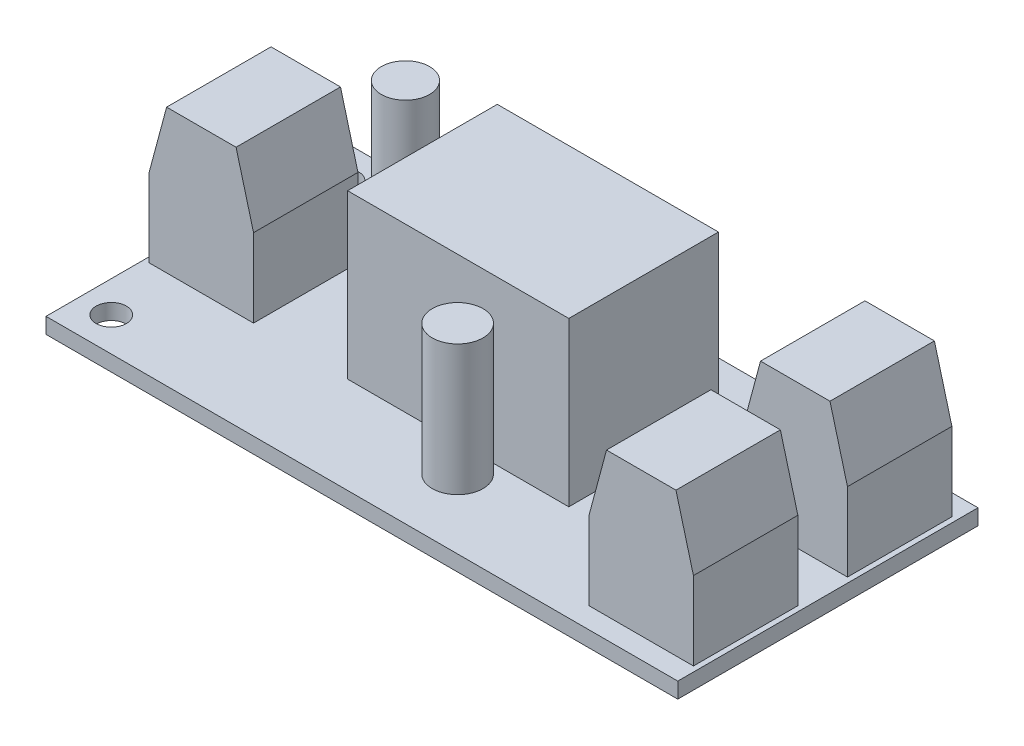
ISO-10303-21;
HEADER;
FILE_DESCRIPTION(('STEP AP214'),'2;1');
FILE_NAME('part.step','',(''),(''),'','','');
FILE_SCHEMA(('AUTOMOTIVE_DESIGN { 1 0 10303 214 1 1 1 1 }'));
ENDSEC;
DATA;
#1=APPLICATION_CONTEXT('core data for automotive mechanical design processes');
#2=APPLICATION_PROTOCOL_DEFINITION('international standard','automotive_design',2000,#1);
#3=PRODUCT_CONTEXT('',#1,'mechanical');
#4=PRODUCT('Part','Part','',(#3));
#5=PRODUCT_RELATED_PRODUCT_CATEGORY('part','',(#4));
#6=PRODUCT_DEFINITION_FORMATION('','',#4);
#7=PRODUCT_DEFINITION_CONTEXT('part definition',#1,'design');
#8=PRODUCT_DEFINITION('design','',#6,#7);
#9=PRODUCT_DEFINITION_SHAPE('','',#8);
#10=(LENGTH_UNIT() NAMED_UNIT(*) SI_UNIT(.MILLI.,.METRE.));
#11=(NAMED_UNIT(*) PLANE_ANGLE_UNIT() SI_UNIT($,.RADIAN.));
#12=(NAMED_UNIT(*) SI_UNIT($,.STERADIAN.) SOLID_ANGLE_UNIT());
#13=UNCERTAINTY_MEASURE_WITH_UNIT(LENGTH_MEASURE(1.E-05),#10,'distance_accuracy_value','');
#14=(GEOMETRIC_REPRESENTATION_CONTEXT(3) GLOBAL_UNCERTAINTY_ASSIGNED_CONTEXT((#13)) GLOBAL_UNIT_ASSIGNED_CONTEXT((#10,
#11,#12)) REPRESENTATION_CONTEXT('',''));
#15=CARTESIAN_POINT('',(0.,0.,0.));
#16=DIRECTION('',(0.,0.,1.));
#17=DIRECTION('',(1.,0.,0.));
#18=AXIS2_PLACEMENT_3D('',#15,#16,#17);
#19=CARTESIAN_POINT('',(0.,0.762,0.));
#20=DIRECTION('',(0.,1.,0.));
#21=DIRECTION('',(0.,0.,1.));
#22=AXIS2_PLACEMENT_3D('',#19,#20,#21);
#23=PLANE('',#22);
#24=CARTESIAN_POINT('',(2.57457069694945,0.762,7.86478445780455));
#25=DIRECTION('',(0.,1.,0.));
#26=DIRECTION('',(0.,0.,1.));
#27=AXIS2_PLACEMENT_3D('',#24,#25,#26);
#28=CIRCLE('',#27,2.46876642173235);
#29=CARTESIAN_POINT('',(2.57457069694945,0.762,10.3335508795369));
#30=VERTEX_POINT('',#29);
#31=EDGE_CURVE('E732',#30,#30,#28,.T.);
#32=ORIENTED_EDGE('',*,*,#31,.F.);
#33=EDGE_LOOP('',(#32));
#34=FACE_BOUND('',#33,.T.);
#35=CARTESIAN_POINT('',(-20.4202251169005,0.762,-10.0514061456245));
#36=DIRECTION('',(0.,1.,0.));
#37=DIRECTION('',(0.,0.,1.));
#38=AXIS2_PLACEMENT_3D('',#35,#36,#37);
#39=CIRCLE('',#38,2.3495);
#40=CARTESIAN_POINT('',(-20.4202251169005,0.762,-7.70190614562454));
#41=VERTEX_POINT('',#40);
#42=EDGE_CURVE('E232',#41,#41,#39,.T.);
#43=ORIENTED_EDGE('',*,*,#42,.F.);
#44=EDGE_LOOP('',(#43));
#45=FACE_BOUND('',#44,.T.);
#46=CARTESIAN_POINT('',(-27.686,0.762000000000001,-11.303));
#47=DIRECTION('',(0.,1.,0.));
#48=DIRECTION('',(0.,0.,1.));
#49=AXIS2_PLACEMENT_3D('',#46,#47,#48);
#50=CIRCLE('',#49,1.47319999999999);
#51=CARTESIAN_POINT('',(-27.686,0.762000000000001,-9.82980000000001));
#52=VERTEX_POINT('',#51);
#53=EDGE_CURVE('E320',#52,#52,#50,.T.);
#54=ORIENTED_EDGE('',*,*,#53,.F.);
#55=EDGE_LOOP('',(#54));
#56=FACE_BOUND('',#55,.T.);
#57=CARTESIAN_POINT('',(-27.686,0.762000000000001,11.303));
#58=DIRECTION('',(0.,1.,0.));
#59=DIRECTION('',(0.,0.,1.));
#60=AXIS2_PLACEMENT_3D('',#57,#58,#59);
#61=CIRCLE('',#60,1.47319999999999);
#62=CARTESIAN_POINT('',(-27.686,0.762000000000001,12.7762));
#63=VERTEX_POINT('',#62);
#64=EDGE_CURVE('E326',#63,#63,#61,.T.);
#65=ORIENTED_EDGE('',*,*,#64,.F.);
#66=EDGE_LOOP('',(#65));
#67=FACE_BOUND('',#66,.T.);
#68=DIRECTION('',(0.,0.,1.));
#69=VECTOR('',#68,1.);
#70=CARTESIAN_POINT('',(-30.734,0.762,-14.605));
#71=LINE('',#70,#69);
#72=CARTESIAN_POINT('',(-30.734,0.762,-14.605));
#73=VERTEX_POINT('',#72);
#74=CARTESIAN_POINT('',(-30.734,0.762,14.605));
#75=VERTEX_POINT('',#74);
#76=EDGE_CURVE('E333',#73,#75,#71,.T.);
#77=ORIENTED_EDGE('',*,*,#76,.T.);
#78=DIRECTION('',(1.,0.,0.));
#79=VECTOR('',#78,1.);
#80=CARTESIAN_POINT('',(-30.734,0.762,14.605));
#81=LINE('',#80,#79);
#82=CARTESIAN_POINT('',(30.734,0.762,14.605));
#83=VERTEX_POINT('',#82);
#84=EDGE_CURVE('E336',#75,#83,#81,.T.);
#85=ORIENTED_EDGE('',*,*,#84,.T.);
#86=DIRECTION('',(0.,0.,-1.));
#87=VECTOR('',#86,1.);
#88=CARTESIAN_POINT('',(30.734,0.762,-14.605));
#89=LINE('',#88,#87);
#90=CARTESIAN_POINT('',(30.734,0.762,-14.605));
#91=VERTEX_POINT('',#90);
#92=EDGE_CURVE('E339',#83,#91,#89,.T.);
#93=ORIENTED_EDGE('',*,*,#92,.T.);
#94=DIRECTION('',(-1.,0.,0.));
#95=VECTOR('',#94,1.);
#96=CARTESIAN_POINT('',(-30.734,0.762,-14.605));
#97=LINE('',#96,#95);
#98=EDGE_CURVE('E341',#91,#73,#97,.T.);
#99=ORIENTED_EDGE('',*,*,#98,.T.);
#100=EDGE_LOOP('',(#77,#85,#93,#99));
#101=FACE_BOUND('',#100,.T.);
#102=DIRECTION('',(1.,0.,0.));
#103=VECTOR('',#102,1.);
#104=CARTESIAN_POINT('',(-30.226,0.762,5.08));
#105=LINE('',#104,#103);
#106=CARTESIAN_POINT('',(-30.226,0.762,5.08));
#107=VERTEX_POINT('',#106);
#108=CARTESIAN_POINT('',(-20.066,0.762,5.08));
#109=VERTEX_POINT('',#108);
#110=EDGE_CURVE('E305',#107,#109,#105,.T.);
#111=ORIENTED_EDGE('',*,*,#110,.F.);
#112=DIRECTION('',(0.,0.,1.));
#113=VECTOR('',#112,1.);
#114=CARTESIAN_POINT('',(-30.226,0.762,-5.08));
#115=LINE('',#114,#113);
#116=CARTESIAN_POINT('',(-30.226,0.762,-5.08));
#117=VERTEX_POINT('',#116);
#118=EDGE_CURVE('E294',#117,#107,#115,.T.);
#119=ORIENTED_EDGE('',*,*,#118,.F.);
#120=DIRECTION('',(-1.,0.,0.));
#121=VECTOR('',#120,1.);
#122=CARTESIAN_POINT('',(-30.226,0.762,-5.08));
#123=LINE('',#122,#121);
#124=CARTESIAN_POINT('',(-20.066,0.762,-5.08));
#125=VERTEX_POINT('',#124);
#126=EDGE_CURVE('E299',#125,#117,#123,.T.);
#127=ORIENTED_EDGE('',*,*,#126,.F.);
#128=DIRECTION('',(0.,0.,-1.));
#129=VECTOR('',#128,1.);
#130=CARTESIAN_POINT('',(-20.066,0.762,-5.08));
#131=LINE('',#130,#129);
#132=EDGE_CURVE('E308',#109,#125,#131,.T.);
#133=ORIENTED_EDGE('',*,*,#132,.F.);
#134=EDGE_LOOP('',(#111,#119,#127,#133));
#135=FACE_BOUND('',#134,.T.);
#136=DIRECTION('',(1.,0.,0.));
#137=VECTOR('',#136,1.);
#138=CARTESIAN_POINT('',(20.066,0.762,-2.413));
#139=LINE('',#138,#137);
#140=CARTESIAN_POINT('',(20.066,0.762,-2.413));
#141=VERTEX_POINT('',#140);
#142=CARTESIAN_POINT('',(30.226,0.762,-2.413));
#143=VERTEX_POINT('',#142);
#144=EDGE_CURVE('E279',#141,#143,#139,.T.);
#145=ORIENTED_EDGE('',*,*,#144,.F.);
#146=DIRECTION('',(0.,0.,1.));
#147=VECTOR('',#146,1.);
#148=CARTESIAN_POINT('',(20.066,0.762,-12.573));
#149=LINE('',#148,#147);
#150=CARTESIAN_POINT('',(20.066,0.762,-12.573));
#151=VERTEX_POINT('',#150);
#152=EDGE_CURVE('E268',#151,#141,#149,.T.);
#153=ORIENTED_EDGE('',*,*,#152,.F.);
#154=DIRECTION('',(-1.,0.,0.));
#155=VECTOR('',#154,1.);
#156=CARTESIAN_POINT('',(20.066,0.762,-12.573));
#157=LINE('',#156,#155);
#158=CARTESIAN_POINT('',(30.226,0.762,-12.573));
#159=VERTEX_POINT('',#158);
#160=EDGE_CURVE('E273',#159,#151,#157,.T.);
#161=ORIENTED_EDGE('',*,*,#160,.F.);
#162=DIRECTION('',(0.,0.,-1.));
#163=VECTOR('',#162,1.);
#164=CARTESIAN_POINT('',(30.226,0.762,-12.573));
#165=LINE('',#164,#163);
#166=EDGE_CURVE('E282',#143,#159,#165,.T.);
#167=ORIENTED_EDGE('',*,*,#166,.F.);
#168=EDGE_LOOP('',(#145,#153,#161,#167));
#169=FACE_BOUND('',#168,.T.);
#170=DIRECTION('',(1.,0.,0.));
#171=VECTOR('',#170,1.);
#172=CARTESIAN_POINT('',(20.066,0.762,12.573));
#173=LINE('',#172,#171);
#174=CARTESIAN_POINT('',(20.066,0.762,12.573));
#175=VERTEX_POINT('',#174);
#176=CARTESIAN_POINT('',(30.226,0.762,12.573));
#177=VERTEX_POINT('',#176);
#178=EDGE_CURVE('E253',#175,#177,#173,.T.);
#179=ORIENTED_EDGE('',*,*,#178,.F.);
#180=DIRECTION('',(0.,0.,1.));
#181=VECTOR('',#180,1.);
#182=CARTESIAN_POINT('',(20.066,0.762,2.413));
#183=LINE('',#182,#181);
#184=CARTESIAN_POINT('',(20.066,0.762,2.413));
#185=VERTEX_POINT('',#184);
#186=EDGE_CURVE('E241',#185,#175,#183,.T.);
#187=ORIENTED_EDGE('',*,*,#186,.F.);
#188=DIRECTION('',(-1.,0.,0.));
#189=VECTOR('',#188,1.);
#190=CARTESIAN_POINT('',(20.066,0.762,2.413));
#191=LINE('',#190,#189);
#192=CARTESIAN_POINT('',(30.226,0.762,2.413));
#193=VERTEX_POINT('',#192);
#194=EDGE_CURVE('E247',#193,#185,#191,.T.);
#195=ORIENTED_EDGE('',*,*,#194,.F.);
#196=DIRECTION('',(0.,0.,-1.));
#197=VECTOR('',#196,1.);
#198=CARTESIAN_POINT('',(30.226,0.762,2.413));
#199=LINE('',#198,#197);
#200=EDGE_CURVE('E256',#177,#193,#199,.T.);
#201=ORIENTED_EDGE('',*,*,#200,.F.);
#202=EDGE_LOOP('',(#179,#187,#195,#201));
#203=FACE_BOUND('',#202,.T.);
#204=DIRECTION('',(1.,0.,0.));
#205=VECTOR('',#204,1.);
#206=CARTESIAN_POINT('',(-10.7687015204722,0.762,5.22328152139436));
#207=LINE('',#206,#205);
#208=CARTESIAN_POINT('',(-10.7687015204722,0.762,5.22328152139436));
#209=VERTEX_POINT('',#208);
#210=CARTESIAN_POINT('',(10.749255944685,0.762,5.22328152139436));
#211=VERTEX_POINT('',#210);
#212=EDGE_CURVE('E734',#209,#211,#207,.T.);
#213=ORIENTED_EDGE('',*,*,#212,.F.);
#214=DIRECTION('',(0.,0.,1.));
#215=VECTOR('',#214,1.);
#216=CARTESIAN_POINT('',(-10.7687015204722,0.762,-9.33777657794747));
#217=LINE('',#216,#215);
#218=CARTESIAN_POINT('',(-10.7687015204722,0.762,-9.33777657794747));
#219=VERTEX_POINT('',#218);
#220=EDGE_CURVE('E230',#219,#209,#217,.T.);
#221=ORIENTED_EDGE('',*,*,#220,.F.);
#222=DIRECTION('',(-1.,0.,0.));
#223=VECTOR('',#222,1.);
#224=CARTESIAN_POINT('',(-10.7687015204722,0.762,-9.33777657794747));
#225=LINE('',#224,#223);
#226=CARTESIAN_POINT('',(10.749255944685,0.762,-9.33777657794747));
#227=VERTEX_POINT('',#226);
#228=EDGE_CURVE('E226',#227,#219,#225,.T.);
#229=ORIENTED_EDGE('',*,*,#228,.F.);
#230=DIRECTION('',(0.,0.,-1.));
#231=VECTOR('',#230,1.);
#232=CARTESIAN_POINT('',(10.749255944685,0.762,-9.33777657794747));
#233=LINE('',#232,#231);
#234=EDGE_CURVE('E743',#211,#227,#233,.T.);
#235=ORIENTED_EDGE('',*,*,#234,.F.);
#236=EDGE_LOOP('',(#213,#221,#229,#235));
#237=FACE_BOUND('',#236,.T.);
#238=ADVANCED_FACE('F34',(#34,#45,#56,#67,#101,#135,#169,#203,#237),#23,.T.);
#239=CARTESIAN_POINT('',(-30.734,0.762,-14.605));
#240=DIRECTION('',(1.,0.,0.));
#241=DIRECTION('',(0.,0.,-1.));
#242=AXIS2_PLACEMENT_3D('',#239,#240,#241);
#243=PLANE('',#242);
#244=DIRECTION('',(0.,0.,1.));
#245=VECTOR('',#244,1.);
#246=CARTESIAN_POINT('',(-30.734,-0.762,-14.605));
#247=LINE('',#246,#245);
#248=CARTESIAN_POINT('',(-30.734,-0.762,-14.605));
#249=VERTEX_POINT('',#248);
#250=CARTESIAN_POINT('',(-30.734,-0.762,14.605));
#251=VERTEX_POINT('',#250);
#252=EDGE_CURVE('E332',#249,#251,#247,.T.);
#253=ORIENTED_EDGE('',*,*,#252,.T.);
#254=DIRECTION('',(0.,-1.,0.));
#255=VECTOR('',#254,1.);
#256=CARTESIAN_POINT('',(-30.734,0.762,14.605));
#257=LINE('',#256,#255);
#258=EDGE_CURVE('E359',#75,#251,#257,.T.);
#259=ORIENTED_EDGE('',*,*,#258,.F.);
#260=ORIENTED_EDGE('',*,*,#76,.F.);
#261=DIRECTION('',(0.,-1.,0.));
#262=VECTOR('',#261,1.);
#263=CARTESIAN_POINT('',(-30.734,0.762,-14.605));
#264=LINE('',#263,#262);
#265=EDGE_CURVE('E343',#73,#249,#264,.T.);
#266=ORIENTED_EDGE('',*,*,#265,.T.);
#267=EDGE_LOOP('',(#253,#259,#260,#266));
#268=FACE_BOUND('',#267,.T.);
#269=ADVANCED_FACE('F450',(#268),#243,.F.);
#270=CARTESIAN_POINT('',(-30.734,0.762,14.605));
#271=DIRECTION('',(0.,0.,-1.));
#272=DIRECTION('',(-1.,0.,0.));
#273=AXIS2_PLACEMENT_3D('',#270,#271,#272);
#274=PLANE('',#273);
#275=DIRECTION('',(1.,0.,0.));
#276=VECTOR('',#275,1.);
#277=CARTESIAN_POINT('',(-30.734,-0.762,14.605));
#278=LINE('',#277,#276);
#279=CARTESIAN_POINT('',(30.734,-0.762,14.605));
#280=VERTEX_POINT('',#279);
#281=EDGE_CURVE('E346',#251,#280,#278,.T.);
#282=ORIENTED_EDGE('',*,*,#281,.T.);
#283=DIRECTION('',(0.,-1.,0.));
#284=VECTOR('',#283,1.);
#285=CARTESIAN_POINT('',(30.734,0.762,14.605));
#286=LINE('',#285,#284);
#287=EDGE_CURVE('E356',#83,#280,#286,.T.);
#288=ORIENTED_EDGE('',*,*,#287,.F.);
#289=ORIENTED_EDGE('',*,*,#84,.F.);
#290=ORIENTED_EDGE('',*,*,#258,.T.);
#291=EDGE_LOOP('',(#282,#288,#289,#290));
#292=FACE_BOUND('',#291,.T.);
#293=ADVANCED_FACE('F456',(#292),#274,.F.);
#294=CARTESIAN_POINT('',(30.734,0.762,-14.605));
#295=DIRECTION('',(-1.,0.,0.));
#296=DIRECTION('',(0.,0.,1.));
#297=AXIS2_PLACEMENT_3D('',#294,#295,#296);
#298=PLANE('',#297);
#299=DIRECTION('',(0.,0.,-1.));
#300=VECTOR('',#299,1.);
#301=CARTESIAN_POINT('',(30.734,-0.762,-14.605));
#302=LINE('',#301,#300);
#303=CARTESIAN_POINT('',(30.734,-0.762,-14.605));
#304=VERTEX_POINT('',#303);
#305=EDGE_CURVE('E348',#280,#304,#302,.T.);
#306=ORIENTED_EDGE('',*,*,#305,.T.);
#307=DIRECTION('',(0.,-1.,0.));
#308=VECTOR('',#307,1.);
#309=CARTESIAN_POINT('',(30.734,0.762,-14.605));
#310=LINE('',#309,#308);
#311=EDGE_CURVE('E353',#91,#304,#310,.T.);
#312=ORIENTED_EDGE('',*,*,#311,.F.);
#313=ORIENTED_EDGE('',*,*,#92,.F.);
#314=ORIENTED_EDGE('',*,*,#287,.T.);
#315=EDGE_LOOP('',(#306,#312,#313,#314));
#316=FACE_BOUND('',#315,.T.);
#317=ADVANCED_FACE('F470',(#316),#298,.F.);
#318=CARTESIAN_POINT('',(-30.734,0.762,-14.605));
#319=DIRECTION('',(0.,0.,1.));
#320=DIRECTION('',(1.,0.,0.));
#321=AXIS2_PLACEMENT_3D('',#318,#319,#320);
#322=PLANE('',#321);
#323=DIRECTION('',(-1.,0.,0.));
#324=VECTOR('',#323,1.);
#325=CARTESIAN_POINT('',(-30.734,-0.762,-14.605));
#326=LINE('',#325,#324);
#327=EDGE_CURVE('E337',#304,#249,#326,.T.);
#328=ORIENTED_EDGE('',*,*,#327,.T.);
#329=ORIENTED_EDGE('',*,*,#265,.F.);
#330=ORIENTED_EDGE('',*,*,#98,.F.);
#331=ORIENTED_EDGE('',*,*,#311,.T.);
#332=EDGE_LOOP('',(#328,#329,#330,#331));
#333=FACE_BOUND('',#332,.T.);
#334=ADVANCED_FACE('F466',(#333),#322,.F.);
#335=CARTESIAN_POINT('',(0.,-0.762,0.));
#336=DIRECTION('',(0.,1.,0.));
#337=DIRECTION('',(0.,0.,1.));
#338=AXIS2_PLACEMENT_3D('',#335,#336,#337);
#339=PLANE('',#338);
#340=CARTESIAN_POINT('',(-27.686,-0.762,-11.303));
#341=DIRECTION('',(0.,1.,0.));
#342=DIRECTION('',(0.,0.,1.));
#343=AXIS2_PLACEMENT_3D('',#340,#341,#342);
#344=CIRCLE('',#343,1.47319999999999);
#345=CARTESIAN_POINT('',(-27.686,-0.762,-9.82980000000001));
#346=VERTEX_POINT('',#345);
#347=EDGE_CURVE('E323',#346,#346,#344,.T.);
#348=ORIENTED_EDGE('',*,*,#347,.T.);
#349=EDGE_LOOP('',(#348));
#350=FACE_BOUND('',#349,.T.);
#351=CARTESIAN_POINT('',(-27.686,-0.762,11.303));
#352=DIRECTION('',(0.,1.,0.));
#353=DIRECTION('',(0.,0.,1.));
#354=AXIS2_PLACEMENT_3D('',#351,#352,#353);
#355=CIRCLE('',#354,1.47319999999999);
#356=CARTESIAN_POINT('',(-27.686,-0.762,12.7762));
#357=VERTEX_POINT('',#356);
#358=EDGE_CURVE('E329',#357,#357,#355,.T.);
#359=ORIENTED_EDGE('',*,*,#358,.T.);
#360=EDGE_LOOP('',(#359));
#361=FACE_BOUND('',#360,.T.);
#362=ORIENTED_EDGE('',*,*,#252,.F.);
#363=ORIENTED_EDGE('',*,*,#327,.F.);
#364=ORIENTED_EDGE('',*,*,#305,.F.);
#365=ORIENTED_EDGE('',*,*,#281,.F.);
#366=EDGE_LOOP('',(#362,#363,#364,#365));
#367=FACE_BOUND('',#366,.T.);
#368=ADVANCED_FACE('F463',(#350,#361,#367),#339,.F.);
#369=CARTESIAN_POINT('',(-27.686,0.762,11.303));
#370=DIRECTION('',(0.,1.,0.));
#371=DIRECTION('',(0.,0.,1.));
#372=AXIS2_PLACEMENT_3D('',#369,#370,#371);
#373=CYLINDRICAL_SURFACE('',#372,1.47319999999999);
#374=ORIENTED_EDGE('',*,*,#358,.F.);
#375=EDGE_LOOP('',(#374));
#376=FACE_BOUND('',#375,.T.);
#377=ORIENTED_EDGE('',*,*,#64,.T.);
#378=EDGE_LOOP('',(#377));
#379=FACE_BOUND('',#378,.T.);
#380=ADVANCED_FACE('F446',(#376,#379),#373,.F.);
#381=CARTESIAN_POINT('',(-27.686,0.762,-11.303));
#382=DIRECTION('',(0.,1.,0.));
#383=DIRECTION('',(0.,0.,1.));
#384=AXIS2_PLACEMENT_3D('',#381,#382,#383);
#385=CYLINDRICAL_SURFACE('',#384,1.47319999999999);
#386=ORIENTED_EDGE('',*,*,#347,.F.);
#387=EDGE_LOOP('',(#386));
#388=FACE_BOUND('',#387,.T.);
#389=ORIENTED_EDGE('',*,*,#53,.T.);
#390=EDGE_LOOP('',(#389));
#391=FACE_BOUND('',#390,.T.);
#392=ADVANCED_FACE('F439',(#388,#391),#385,.F.);
#393=CARTESIAN_POINT('',(-30.226,14.732,-5.08));
#394=DIRECTION('',(1.,0.,0.));
#395=DIRECTION('',(0.,0.,-1.));
#396=AXIS2_PLACEMENT_3D('',#393,#394,#395);
#397=PLANE('',#396);
#398=DIRECTION('',(0.,-1.,0.));
#399=VECTOR('',#398,1.);
#400=CARTESIAN_POINT('',(-30.226,14.732,5.08));
#401=LINE('',#400,#399);
#402=CARTESIAN_POINT('',(-30.226,8.3819999999999,5.08));
#403=VERTEX_POINT('',#402);
#404=EDGE_CURVE('E318',#403,#107,#401,.T.);
#405=ORIENTED_EDGE('',*,*,#404,.F.);
#406=DIRECTION('',(0.,0.,-1.));
#407=VECTOR('',#406,1.);
#408=CARTESIAN_POINT('',(-30.226,8.3819999999999,-5.08));
#409=LINE('',#408,#407);
#410=CARTESIAN_POINT('',(-30.226,8.3819999999999,-5.08));
#411=VERTEX_POINT('',#410);
#412=EDGE_CURVE('E11',#403,#411,#409,.T.);
#413=ORIENTED_EDGE('',*,*,#412,.T.);
#414=DIRECTION('',(0.,-1.,0.));
#415=VECTOR('',#414,1.);
#416=CARTESIAN_POINT('',(-30.226,14.732,-5.08));
#417=LINE('',#416,#415);
#418=EDGE_CURVE('E302',#411,#117,#417,.T.);
#419=ORIENTED_EDGE('',*,*,#418,.T.);
#420=ORIENTED_EDGE('',*,*,#118,.T.);
#421=EDGE_LOOP('',(#405,#413,#419,#420));
#422=FACE_BOUND('',#421,.T.);
#423=ADVANCED_FACE('F437',(#422),#397,.F.);
#424=CARTESIAN_POINT('',(-30.226,14.732,5.08));
#425=DIRECTION('',(0.,0.,-1.));
#426=DIRECTION('',(-1.,0.,0.));
#427=AXIS2_PLACEMENT_3D('',#424,#425,#426);
#428=PLANE('',#427);
#429=DIRECTION('',(0.,-1.,0.));
#430=VECTOR('',#429,1.);
#431=CARTESIAN_POINT('',(-20.066,14.732,5.08));
#432=LINE('',#431,#430);
#433=CARTESIAN_POINT('',(-20.066,8.38199999999991,5.08));
#434=VERTEX_POINT('',#433);
#435=EDGE_CURVE('E316',#434,#109,#432,.T.);
#436=ORIENTED_EDGE('',*,*,#435,.F.);
#437=DIRECTION('',(-0.258819045102518,0.965925826289069,0.));
#438=VECTOR('',#437,1.);
#439=CARTESIAN_POINT('',(-21.7674773719376,14.732,5.08));
#440=LINE('',#439,#438);
#441=CARTESIAN_POINT('',(-21.7674773719376,14.732,5.08));
#442=VERTEX_POINT('',#441);
#443=EDGE_CURVE('E43',#434,#442,#440,.T.);
#444=ORIENTED_EDGE('',*,*,#443,.T.);
#445=DIRECTION('',(1.,0.,0.));
#446=VECTOR('',#445,1.);
#447=CARTESIAN_POINT('',(-30.226,14.732,5.08));
#448=LINE('',#447,#446);
#449=CARTESIAN_POINT('',(-28.5245226280624,14.732,5.08));
#450=VERTEX_POINT('',#449);
#451=EDGE_CURVE('E295',#450,#442,#448,.T.);
#452=ORIENTED_EDGE('',*,*,#451,.F.);
#453=DIRECTION('',(-0.258819045102518,-0.965925826289069,0.));
#454=VECTOR('',#453,1.);
#455=CARTESIAN_POINT('',(-28.5245226280624,14.732,5.08));
#456=LINE('',#455,#454);
#457=EDGE_CURVE('E58',#450,#403,#456,.T.);
#458=ORIENTED_EDGE('',*,*,#457,.T.);
#459=ORIENTED_EDGE('',*,*,#404,.T.);
#460=ORIENTED_EDGE('',*,*,#110,.T.);
#461=EDGE_LOOP('',(#436,#444,#452,#458,#459,#460));
#462=FACE_BOUND('',#461,.T.);
#463=ADVANCED_FACE('F412',(#462),#428,.F.);
#464=CARTESIAN_POINT('',(-20.066,14.732,-5.08));
#465=DIRECTION('',(-1.,0.,0.));
#466=DIRECTION('',(0.,0.,1.));
#467=AXIS2_PLACEMENT_3D('',#464,#465,#466);
#468=PLANE('',#467);
#469=DIRECTION('',(0.,-1.,0.));
#470=VECTOR('',#469,1.);
#471=CARTESIAN_POINT('',(-20.066,14.732,-5.08));
#472=LINE('',#471,#470);
#473=CARTESIAN_POINT('',(-20.066,8.38199999999991,-5.08));
#474=VERTEX_POINT('',#473);
#475=EDGE_CURVE('E314',#474,#125,#472,.T.);
#476=ORIENTED_EDGE('',*,*,#475,.F.);
#477=DIRECTION('',(0.,0.,1.));
#478=VECTOR('',#477,1.);
#479=CARTESIAN_POINT('',(-20.066,8.38199999999991,5.08));
#480=LINE('',#479,#478);
#481=EDGE_CURVE('E408',#474,#434,#480,.T.);
#482=ORIENTED_EDGE('',*,*,#481,.T.);
#483=ORIENTED_EDGE('',*,*,#435,.T.);
#484=ORIENTED_EDGE('',*,*,#132,.T.);
#485=EDGE_LOOP('',(#476,#482,#483,#484));
#486=FACE_BOUND('',#485,.T.);
#487=ADVANCED_FACE('F425',(#486),#468,.F.);
#488=CARTESIAN_POINT('',(-30.226,14.732,-5.08));
#489=DIRECTION('',(0.,0.,1.));
#490=DIRECTION('',(1.,0.,0.));
#491=AXIS2_PLACEMENT_3D('',#488,#489,#490);
#492=PLANE('',#491);
#493=DIRECTION('',(-1.,0.,0.));
#494=VECTOR('',#493,1.);
#495=CARTESIAN_POINT('',(-30.226,14.732,-5.08));
#496=LINE('',#495,#494);
#497=CARTESIAN_POINT('',(-21.7674773719376,14.732,-5.08));
#498=VERTEX_POINT('',#497);
#499=CARTESIAN_POINT('',(-28.5245226280624,14.732,-5.08));
#500=VERTEX_POINT('',#499);
#501=EDGE_CURVE('E298',#498,#500,#496,.T.);
#502=ORIENTED_EDGE('',*,*,#501,.F.);
#503=DIRECTION('',(0.258819045102518,-0.965925826289069,0.));
#504=VECTOR('',#503,1.);
#505=CARTESIAN_POINT('',(-21.7674773719376,14.732,-5.08));
#506=LINE('',#505,#504);
#507=EDGE_CURVE('E406',#498,#474,#506,.T.);
#508=ORIENTED_EDGE('',*,*,#507,.T.);
#509=ORIENTED_EDGE('',*,*,#475,.T.);
#510=ORIENTED_EDGE('',*,*,#126,.T.);
#511=ORIENTED_EDGE('',*,*,#418,.F.);
#512=DIRECTION('',(0.258819045102518,0.965925826289069,0.));
#513=VECTOR('',#512,1.);
#514=CARTESIAN_POINT('',(-28.5245226280624,14.732,-5.08));
#515=LINE('',#514,#513);
#516=EDGE_CURVE('E404',#411,#500,#515,.T.);
#517=ORIENTED_EDGE('',*,*,#516,.T.);
#518=EDGE_LOOP('',(#502,#508,#509,#510,#511,#517));
#519=FACE_BOUND('',#518,.T.);
#520=ADVANCED_FACE('F423',(#519),#492,.F.);
#521=CARTESIAN_POINT('',(0.,14.732,0.));
#522=DIRECTION('',(0.,1.,0.));
#523=DIRECTION('',(0.,0.,1.));
#524=AXIS2_PLACEMENT_3D('',#521,#522,#523);
#525=PLANE('',#524);
#526=ORIENTED_EDGE('',*,*,#451,.T.);
#527=DIRECTION('',(0.,0.,-1.));
#528=VECTOR('',#527,1.);
#529=CARTESIAN_POINT('',(-21.7674773719376,14.732,-5.08));
#530=LINE('',#529,#528);
#531=EDGE_CURVE('E401',#442,#498,#530,.T.);
#532=ORIENTED_EDGE('',*,*,#531,.T.);
#533=ORIENTED_EDGE('',*,*,#501,.T.);
#534=DIRECTION('',(0.,0.,1.));
#535=VECTOR('',#534,1.);
#536=CARTESIAN_POINT('',(-28.5245226280624,14.732,5.08));
#537=LINE('',#536,#535);
#538=EDGE_CURVE('E398',#500,#450,#537,.T.);
#539=ORIENTED_EDGE('',*,*,#538,.T.);
#540=EDGE_LOOP('',(#526,#532,#533,#539));
#541=FACE_BOUND('',#540,.T.);
#542=ADVANCED_FACE('F417',(#541),#525,.T.);
#543=CARTESIAN_POINT('',(20.066,14.732,-12.573));
#544=DIRECTION('',(1.,0.,0.));
#545=DIRECTION('',(0.,0.,-1.));
#546=AXIS2_PLACEMENT_3D('',#543,#544,#545);
#547=PLANE('',#546);
#548=DIRECTION('',(0.,-1.,0.));
#549=VECTOR('',#548,1.);
#550=CARTESIAN_POINT('',(20.066,14.732,-2.413));
#551=LINE('',#550,#549);
#552=CARTESIAN_POINT('',(20.066,8.38199999999991,-2.413));
#553=VERTEX_POINT('',#552);
#554=EDGE_CURVE('E292',#553,#141,#551,.T.);
#555=ORIENTED_EDGE('',*,*,#554,.F.);
#556=DIRECTION('',(0.,0.,-1.));
#557=VECTOR('',#556,1.);
#558=CARTESIAN_POINT('',(20.066,8.38199999999991,-12.573));
#559=LINE('',#558,#557);
#560=CARTESIAN_POINT('',(20.066,8.38199999999991,-12.573));
#561=VERTEX_POINT('',#560);
#562=EDGE_CURVE('E388',#553,#561,#559,.T.);
#563=ORIENTED_EDGE('',*,*,#562,.T.);
#564=DIRECTION('',(0.,-1.,0.));
#565=VECTOR('',#564,1.);
#566=CARTESIAN_POINT('',(20.066,14.732,-12.573));
#567=LINE('',#566,#565);
#568=EDGE_CURVE('E276',#561,#151,#567,.T.);
#569=ORIENTED_EDGE('',*,*,#568,.T.);
#570=ORIENTED_EDGE('',*,*,#152,.T.);
#571=EDGE_LOOP('',(#555,#563,#569,#570));
#572=FACE_BOUND('',#571,.T.);
#573=ADVANCED_FACE('F563',(#572),#547,.F.);
#574=CARTESIAN_POINT('',(20.066,14.732,-2.413));
#575=DIRECTION('',(0.,0.,-1.));
#576=DIRECTION('',(-1.,0.,0.));
#577=AXIS2_PLACEMENT_3D('',#574,#575,#576);
#578=PLANE('',#577);
#579=DIRECTION('',(1.,0.,0.));
#580=VECTOR('',#579,1.);
#581=CARTESIAN_POINT('',(20.066,14.732,-2.413));
#582=LINE('',#581,#580);
#583=CARTESIAN_POINT('',(21.7674773719376,14.732,-2.413));
#584=VERTEX_POINT('',#583);
#585=CARTESIAN_POINT('',(28.5245226280624,14.732,-2.413));
#586=VERTEX_POINT('',#585);
#587=EDGE_CURVE('E269',#584,#586,#582,.T.);
#588=ORIENTED_EDGE('',*,*,#587,.F.);
#589=DIRECTION('',(-0.258819045102518,-0.965925826289069,0.));
#590=VECTOR('',#589,1.);
#591=CARTESIAN_POINT('',(21.7674773719376,14.732,-2.413));
#592=LINE('',#591,#590);
#593=EDGE_CURVE('E386',#584,#553,#592,.T.);
#594=ORIENTED_EDGE('',*,*,#593,.T.);
#595=ORIENTED_EDGE('',*,*,#554,.T.);
#596=ORIENTED_EDGE('',*,*,#144,.T.);
#597=DIRECTION('',(0.,-1.,0.));
#598=VECTOR('',#597,1.);
#599=CARTESIAN_POINT('',(30.226,14.732,-2.413));
#600=LINE('',#599,#598);
#601=CARTESIAN_POINT('',(30.226,8.38199999999993,-2.413));
#602=VERTEX_POINT('',#601);
#603=EDGE_CURVE('E290',#602,#143,#600,.T.);
#604=ORIENTED_EDGE('',*,*,#603,.F.);
#605=DIRECTION('',(-0.258819045102518,0.965925826289069,0.));
#606=VECTOR('',#605,1.);
#607=CARTESIAN_POINT('',(28.5245226280624,14.732,-2.413));
#608=LINE('',#607,#606);
#609=EDGE_CURVE('E384',#602,#586,#608,.T.);
#610=ORIENTED_EDGE('',*,*,#609,.T.);
#611=EDGE_LOOP('',(#588,#594,#595,#596,#604,#610));
#612=FACE_BOUND('',#611,.T.);
#613=ADVANCED_FACE('F559',(#612),#578,.F.);
#614=CARTESIAN_POINT('',(30.226,14.732,-12.573));
#615=DIRECTION('',(-1.,0.,0.));
#616=DIRECTION('',(0.,0.,1.));
#617=AXIS2_PLACEMENT_3D('',#614,#615,#616);
#618=PLANE('',#617);
#619=DIRECTION('',(0.,-1.,0.));
#620=VECTOR('',#619,1.);
#621=CARTESIAN_POINT('',(30.226,14.732,-12.573));
#622=LINE('',#621,#620);
#623=CARTESIAN_POINT('',(30.226,8.38199999999993,-12.573));
#624=VERTEX_POINT('',#623);
#625=EDGE_CURVE('E288',#624,#159,#622,.T.);
#626=ORIENTED_EDGE('',*,*,#625,.F.);
#627=DIRECTION('',(0.,0.,1.));
#628=VECTOR('',#627,1.);
#629=CARTESIAN_POINT('',(30.226,8.38199999999993,-2.413));
#630=LINE('',#629,#628);
#631=EDGE_CURVE('E394',#624,#602,#630,.T.);
#632=ORIENTED_EDGE('',*,*,#631,.T.);
#633=ORIENTED_EDGE('',*,*,#603,.T.);
#634=ORIENTED_EDGE('',*,*,#166,.T.);
#635=EDGE_LOOP('',(#626,#632,#633,#634));
#636=FACE_BOUND('',#635,.T.);
#637=ADVANCED_FACE('F555',(#636),#618,.F.);
#638=CARTESIAN_POINT('',(20.066,14.732,-12.573));
#639=DIRECTION('',(0.,0.,1.));
#640=DIRECTION('',(1.,0.,0.));
#641=AXIS2_PLACEMENT_3D('',#638,#639,#640);
#642=PLANE('',#641);
#643=ORIENTED_EDGE('',*,*,#568,.F.);
#644=DIRECTION('',(0.258819045102518,0.965925826289069,0.));
#645=VECTOR('',#644,1.);
#646=CARTESIAN_POINT('',(21.7674773719376,14.732,-12.573));
#647=LINE('',#646,#645);
#648=CARTESIAN_POINT('',(21.7674773719376,14.732,-12.573));
#649=VERTEX_POINT('',#648);
#650=EDGE_CURVE('E392',#561,#649,#647,.T.);
#651=ORIENTED_EDGE('',*,*,#650,.T.);
#652=DIRECTION('',(-1.,0.,0.));
#653=VECTOR('',#652,1.);
#654=CARTESIAN_POINT('',(20.066,14.732,-12.573));
#655=LINE('',#654,#653);
#656=CARTESIAN_POINT('',(28.5245226280624,14.732,-12.573));
#657=VERTEX_POINT('',#656);
#658=EDGE_CURVE('E272',#657,#649,#655,.T.);
#659=ORIENTED_EDGE('',*,*,#658,.F.);
#660=DIRECTION('',(0.258819045102518,-0.965925826289069,0.));
#661=VECTOR('',#660,1.);
#662=CARTESIAN_POINT('',(28.5245226280624,14.732,-12.573));
#663=LINE('',#662,#661);
#664=EDGE_CURVE('E390',#657,#624,#663,.T.);
#665=ORIENTED_EDGE('',*,*,#664,.T.);
#666=ORIENTED_EDGE('',*,*,#625,.T.);
#667=ORIENTED_EDGE('',*,*,#160,.T.);
#668=EDGE_LOOP('',(#643,#651,#659,#665,#666,#667));
#669=FACE_BOUND('',#668,.T.);
#670=ADVANCED_FACE('F551',(#669),#642,.F.);
#671=CARTESIAN_POINT('',(0.,14.732,0.));
#672=DIRECTION('',(0.,1.,0.));
#673=DIRECTION('',(0.,0.,1.));
#674=AXIS2_PLACEMENT_3D('',#671,#672,#673);
#675=PLANE('',#674);
#676=ORIENTED_EDGE('',*,*,#658,.T.);
#677=DIRECTION('',(0.,0.,1.));
#678=VECTOR('',#677,1.);
#679=CARTESIAN_POINT('',(21.7674773719376,14.732,-2.413));
#680=LINE('',#679,#678);
#681=EDGE_CURVE('E381',#649,#584,#680,.T.);
#682=ORIENTED_EDGE('',*,*,#681,.T.);
#683=ORIENTED_EDGE('',*,*,#587,.T.);
#684=DIRECTION('',(0.,0.,-1.));
#685=VECTOR('',#684,1.);
#686=CARTESIAN_POINT('',(28.5245226280624,14.732,-12.573));
#687=LINE('',#686,#685);
#688=EDGE_CURVE('E378',#586,#657,#687,.T.);
#689=ORIENTED_EDGE('',*,*,#688,.T.);
#690=EDGE_LOOP('',(#676,#682,#683,#689));
#691=FACE_BOUND('',#690,.T.);
#692=ADVANCED_FACE('F547',(#691),#675,.T.);
#693=CARTESIAN_POINT('',(20.066,14.732,2.413));
#694=DIRECTION('',(1.,0.,0.));
#695=DIRECTION('',(0.,0.,-1.));
#696=AXIS2_PLACEMENT_3D('',#693,#694,#695);
#697=PLANE('',#696);
#698=DIRECTION('',(0.,-1.,0.));
#699=VECTOR('',#698,1.);
#700=CARTESIAN_POINT('',(20.066,14.732,12.573));
#701=LINE('',#700,#699);
#702=CARTESIAN_POINT('',(20.066,8.38199999999991,12.573));
#703=VERTEX_POINT('',#702);
#704=EDGE_CURVE('E266',#703,#175,#701,.T.);
#705=ORIENTED_EDGE('',*,*,#704,.F.);
#706=DIRECTION('',(0.,0.,-1.));
#707=VECTOR('',#706,1.);
#708=CARTESIAN_POINT('',(20.066,8.38199999999991,2.413));
#709=LINE('',#708,#707);
#710=CARTESIAN_POINT('',(20.066,8.38199999999991,2.413));
#711=VERTEX_POINT('',#710);
#712=EDGE_CURVE('E372',#703,#711,#709,.T.);
#713=ORIENTED_EDGE('',*,*,#712,.T.);
#714=DIRECTION('',(0.,-1.,0.));
#715=VECTOR('',#714,1.);
#716=CARTESIAN_POINT('',(20.066,14.732,2.413));
#717=LINE('',#716,#715);
#718=EDGE_CURVE('E250',#711,#185,#717,.T.);
#719=ORIENTED_EDGE('',*,*,#718,.T.);
#720=ORIENTED_EDGE('',*,*,#186,.T.);
#721=EDGE_LOOP('',(#705,#713,#719,#720));
#722=FACE_BOUND('',#721,.T.);
#723=ADVANCED_FACE('F543',(#722),#697,.F.);
#724=CARTESIAN_POINT('',(20.066,14.732,12.573));
#725=DIRECTION('',(0.,0.,-1.));
#726=DIRECTION('',(-1.,0.,0.));
#727=AXIS2_PLACEMENT_3D('',#724,#725,#726);
#728=PLANE('',#727);
#729=DIRECTION('',(1.,0.,0.));
#730=VECTOR('',#729,1.);
#731=CARTESIAN_POINT('',(20.066,14.732,12.573));
#732=LINE('',#731,#730);
#733=CARTESIAN_POINT('',(21.7674773719376,14.732,12.573));
#734=VERTEX_POINT('',#733);
#735=CARTESIAN_POINT('',(28.5245226280624,14.732,12.573));
#736=VERTEX_POINT('',#735);
#737=EDGE_CURVE('E243',#734,#736,#732,.T.);
#738=ORIENTED_EDGE('',*,*,#737,.F.);
#739=DIRECTION('',(-0.258819045102518,-0.965925826289069,0.));
#740=VECTOR('',#739,1.);
#741=CARTESIAN_POINT('',(21.7674773719376,14.732,12.573));
#742=LINE('',#741,#740);
#743=EDGE_CURVE('E370',#734,#703,#742,.T.);
#744=ORIENTED_EDGE('',*,*,#743,.T.);
#745=ORIENTED_EDGE('',*,*,#704,.T.);
#746=ORIENTED_EDGE('',*,*,#178,.T.);
#747=DIRECTION('',(0.,-1.,0.));
#748=VECTOR('',#747,1.);
#749=CARTESIAN_POINT('',(30.226,14.732,12.573));
#750=LINE('',#749,#748);
#751=CARTESIAN_POINT('',(30.226,8.38199999999993,12.573));
#752=VERTEX_POINT('',#751);
#753=EDGE_CURVE('E264',#752,#177,#750,.T.);
#754=ORIENTED_EDGE('',*,*,#753,.F.);
#755=DIRECTION('',(-0.258819045102518,0.965925826289069,0.));
#756=VECTOR('',#755,1.);
#757=CARTESIAN_POINT('',(28.5245226280624,14.732,12.573));
#758=LINE('',#757,#756);
#759=EDGE_CURVE('E368',#752,#736,#758,.T.);
#760=ORIENTED_EDGE('',*,*,#759,.T.);
#761=EDGE_LOOP('',(#738,#744,#745,#746,#754,#760));
#762=FACE_BOUND('',#761,.T.);
#763=ADVANCED_FACE('F539',(#762),#728,.F.);
#764=CARTESIAN_POINT('',(30.226,14.732,2.413));
#765=DIRECTION('',(-1.,0.,0.));
#766=DIRECTION('',(0.,0.,1.));
#767=AXIS2_PLACEMENT_3D('',#764,#765,#766);
#768=PLANE('',#767);
#769=DIRECTION('',(0.,-1.,0.));
#770=VECTOR('',#769,1.);
#771=CARTESIAN_POINT('',(30.226,14.732,2.413));
#772=LINE('',#771,#770);
#773=CARTESIAN_POINT('',(30.226,8.38199999999993,2.413));
#774=VERTEX_POINT('',#773);
#775=EDGE_CURVE('E262',#774,#193,#772,.T.);
#776=ORIENTED_EDGE('',*,*,#775,.F.);
#777=DIRECTION('',(0.,0.,1.));
#778=VECTOR('',#777,1.);
#779=CARTESIAN_POINT('',(30.226,8.38199999999993,12.573));
#780=LINE('',#779,#778);
#781=EDGE_CURVE('E396',#774,#752,#780,.T.);
#782=ORIENTED_EDGE('',*,*,#781,.T.);
#783=ORIENTED_EDGE('',*,*,#753,.T.);
#784=ORIENTED_EDGE('',*,*,#200,.T.);
#785=EDGE_LOOP('',(#776,#782,#783,#784));
#786=FACE_BOUND('',#785,.T.);
#787=ADVANCED_FACE('F535',(#786),#768,.F.);
#788=CARTESIAN_POINT('',(20.066,14.732,2.413));
#789=DIRECTION('',(0.,0.,1.));
#790=DIRECTION('',(1.,0.,0.));
#791=AXIS2_PLACEMENT_3D('',#788,#789,#790);
#792=PLANE('',#791);
#793=ORIENTED_EDGE('',*,*,#718,.F.);
#794=DIRECTION('',(0.258819045102518,0.965925826289069,0.));
#795=VECTOR('',#794,1.);
#796=CARTESIAN_POINT('',(21.7674773719376,14.732,2.413));
#797=LINE('',#796,#795);
#798=CARTESIAN_POINT('',(21.7674773719376,14.732,2.413));
#799=VERTEX_POINT('',#798);
#800=EDGE_CURVE('E376',#711,#799,#797,.T.);
#801=ORIENTED_EDGE('',*,*,#800,.T.);
#802=DIRECTION('',(-1.,0.,0.));
#803=VECTOR('',#802,1.);
#804=CARTESIAN_POINT('',(20.066,14.732,2.413));
#805=LINE('',#804,#803);
#806=CARTESIAN_POINT('',(28.5245226280624,14.732,2.413));
#807=VERTEX_POINT('',#806);
#808=EDGE_CURVE('E246',#807,#799,#805,.T.);
#809=ORIENTED_EDGE('',*,*,#808,.F.);
#810=DIRECTION('',(0.258819045102518,-0.965925826289069,0.));
#811=VECTOR('',#810,1.);
#812=CARTESIAN_POINT('',(28.5245226280624,14.732,2.413));
#813=LINE('',#812,#811);
#814=EDGE_CURVE('E374',#807,#774,#813,.T.);
#815=ORIENTED_EDGE('',*,*,#814,.T.);
#816=ORIENTED_EDGE('',*,*,#775,.T.);
#817=ORIENTED_EDGE('',*,*,#194,.T.);
#818=EDGE_LOOP('',(#793,#801,#809,#815,#816,#817));
#819=FACE_BOUND('',#818,.T.);
#820=ADVANCED_FACE('F531',(#819),#792,.F.);
#821=CARTESIAN_POINT('',(0.,14.732,0.));
#822=DIRECTION('',(0.,1.,0.));
#823=DIRECTION('',(0.,0.,1.));
#824=AXIS2_PLACEMENT_3D('',#821,#822,#823);
#825=PLANE('',#824);
#826=ORIENTED_EDGE('',*,*,#808,.T.);
#827=DIRECTION('',(0.,0.,1.));
#828=VECTOR('',#827,1.);
#829=CARTESIAN_POINT('',(21.7674773719376,14.732,12.573));
#830=LINE('',#829,#828);
#831=EDGE_CURVE('E365',#799,#734,#830,.T.);
#832=ORIENTED_EDGE('',*,*,#831,.T.);
#833=ORIENTED_EDGE('',*,*,#737,.T.);
#834=DIRECTION('',(0.,0.,-1.));
#835=VECTOR('',#834,1.);
#836=CARTESIAN_POINT('',(28.5245226280624,14.732,2.413));
#837=LINE('',#836,#835);
#838=EDGE_CURVE('E362',#736,#807,#837,.T.);
#839=ORIENTED_EDGE('',*,*,#838,.T.);
#840=EDGE_LOOP('',(#826,#832,#833,#839));
#841=FACE_BOUND('',#840,.T.);
#842=ADVANCED_FACE('F486',(#841),#825,.T.);
#843=CARTESIAN_POINT('',(21.7674773719376,14.732,0.));
#844=DIRECTION('',(-0.965925826289069,0.258819045102518,0.));
#845=DIRECTION('',(0.,0.,-1.));
#846=AXIS2_PLACEMENT_3D('',#843,#844,#845);
#847=PLANE('',#846);
#848=ORIENTED_EDGE('',*,*,#800,.F.);
#849=ORIENTED_EDGE('',*,*,#712,.F.);
#850=ORIENTED_EDGE('',*,*,#743,.F.);
#851=ORIENTED_EDGE('',*,*,#831,.F.);
#852=EDGE_LOOP('',(#848,#849,#850,#851));
#853=FACE_BOUND('',#852,.T.);
#854=ADVANCED_FACE('F479',(#853),#847,.T.);
#855=CARTESIAN_POINT('',(21.7674773719376,14.732,0.));
#856=DIRECTION('',(-0.965925826289069,0.258819045102518,0.));
#857=DIRECTION('',(0.,0.,-1.));
#858=AXIS2_PLACEMENT_3D('',#855,#856,#857);
#859=PLANE('',#858);
#860=ORIENTED_EDGE('',*,*,#650,.F.);
#861=ORIENTED_EDGE('',*,*,#562,.F.);
#862=ORIENTED_EDGE('',*,*,#593,.F.);
#863=ORIENTED_EDGE('',*,*,#681,.F.);
#864=EDGE_LOOP('',(#860,#861,#862,#863));
#865=FACE_BOUND('',#864,.T.);
#866=ADVANCED_FACE('F485',(#865),#859,.T.);
#867=CARTESIAN_POINT('',(28.5245226280624,14.732,0.));
#868=DIRECTION('',(0.965925826289069,0.258819045102518,0.));
#869=DIRECTION('',(0.,0.,1.));
#870=AXIS2_PLACEMENT_3D('',#867,#868,#869);
#871=PLANE('',#870);
#872=ORIENTED_EDGE('',*,*,#609,.F.);
#873=ORIENTED_EDGE('',*,*,#631,.F.);
#874=ORIENTED_EDGE('',*,*,#664,.F.);
#875=ORIENTED_EDGE('',*,*,#688,.F.);
#876=EDGE_LOOP('',(#872,#873,#874,#875));
#877=FACE_BOUND('',#876,.T.);
#878=ADVANCED_FACE('F493',(#877),#871,.T.);
#879=CARTESIAN_POINT('',(28.5245226280624,14.732,0.));
#880=DIRECTION('',(0.965925826289069,0.258819045102518,0.));
#881=DIRECTION('',(0.,0.,1.));
#882=AXIS2_PLACEMENT_3D('',#879,#880,#881);
#883=PLANE('',#882);
#884=ORIENTED_EDGE('',*,*,#759,.F.);
#885=ORIENTED_EDGE('',*,*,#781,.F.);
#886=ORIENTED_EDGE('',*,*,#814,.F.);
#887=ORIENTED_EDGE('',*,*,#838,.F.);
#888=EDGE_LOOP('',(#884,#885,#886,#887));
#889=FACE_BOUND('',#888,.T.);
#890=ADVANCED_FACE('F500',(#889),#883,.T.);
#891=CARTESIAN_POINT('',(-21.7674773719376,14.732,0.));
#892=DIRECTION('',(0.965925826289069,0.258819045102518,0.));
#893=DIRECTION('',(0.,0.,1.));
#894=AXIS2_PLACEMENT_3D('',#891,#892,#893);
#895=PLANE('',#894);
#896=ORIENTED_EDGE('',*,*,#443,.F.);
#897=ORIENTED_EDGE('',*,*,#481,.F.);
#898=ORIENTED_EDGE('',*,*,#507,.F.);
#899=ORIENTED_EDGE('',*,*,#531,.F.);
#900=EDGE_LOOP('',(#896,#897,#898,#899));
#901=FACE_BOUND('',#900,.T.);
#902=ADVANCED_FACE('F420',(#901),#895,.T.);
#903=CARTESIAN_POINT('',(-28.5245226280624,14.732,0.));
#904=DIRECTION('',(-0.965925826289069,0.258819045102518,0.));
#905=DIRECTION('',(0.,0.,-1.));
#906=AXIS2_PLACEMENT_3D('',#903,#904,#905);
#907=PLANE('',#906);
#908=ORIENTED_EDGE('',*,*,#516,.F.);
#909=ORIENTED_EDGE('',*,*,#412,.F.);
#910=ORIENTED_EDGE('',*,*,#457,.F.);
#911=ORIENTED_EDGE('',*,*,#538,.F.);
#912=EDGE_LOOP('',(#908,#909,#910,#911));
#913=FACE_BOUND('',#912,.T.);
#914=ADVANCED_FACE('F37',(#913),#907,.T.);
#915=CARTESIAN_POINT('',(-20.4202251169005,13.462,-10.0514061456245));
#916=DIRECTION('',(0.,-1.,0.));
#917=DIRECTION('',(0.,0.,-1.));
#918=AXIS2_PLACEMENT_3D('',#915,#916,#917);
#919=CYLINDRICAL_SURFACE('',#918,2.3495);
#920=CARTESIAN_POINT('',(-20.4202251169005,13.462,-10.0514061456245));
#921=DIRECTION('',(0.,1.,0.));
#922=DIRECTION('',(0.,0.,1.));
#923=AXIS2_PLACEMENT_3D('',#920,#921,#922);
#924=CIRCLE('',#923,2.3495);
#925=CARTESIAN_POINT('',(-20.4202251169005,13.462,-7.70190614562454));
#926=VERTEX_POINT('',#925);
#927=EDGE_CURVE('E235',#926,#926,#924,.T.);
#928=ORIENTED_EDGE('',*,*,#927,.F.);
#929=EDGE_LOOP('',(#928));
#930=FACE_BOUND('',#929,.T.);
#931=ORIENTED_EDGE('',*,*,#42,.T.);
#932=EDGE_LOOP('',(#931));
#933=FACE_BOUND('',#932,.T.);
#934=ADVANCED_FACE('F513',(#930,#933),#919,.T.);
#935=CARTESIAN_POINT('',(-20.4202251169005,13.462,-10.0514061456245));
#936=DIRECTION('',(0.,1.,0.));
#937=DIRECTION('',(0.,0.,1.));
#938=AXIS2_PLACEMENT_3D('',#935,#936,#937);
#939=PLANE('',#938);
#940=ORIENTED_EDGE('',*,*,#927,.T.);
#941=EDGE_LOOP('',(#940));
#942=FACE_BOUND('',#941,.T.);
#943=ADVANCED_FACE('F517',(#942),#939,.T.);
#944=CARTESIAN_POINT('',(-10.7687015204722,16.637,-9.33777657794747));
#945=DIRECTION('',(1.,0.,0.));
#946=DIRECTION('',(0.,0.,-1.));
#947=AXIS2_PLACEMENT_3D('',#944,#945,#946);
#948=PLANE('',#947);
#949=ORIENTED_EDGE('',*,*,#220,.T.);
#950=DIRECTION('',(0.,-1.,0.));
#951=VECTOR('',#950,1.);
#952=CARTESIAN_POINT('',(-10.7687015204722,16.637,5.22328152139436));
#953=LINE('',#952,#951);
#954=CARTESIAN_POINT('',(-10.7687015204722,16.637,5.22328152139436));
#955=VERTEX_POINT('',#954);
#956=EDGE_CURVE('E211',#955,#209,#953,.T.);
#957=ORIENTED_EDGE('',*,*,#956,.F.);
#958=DIRECTION('',(0.,0.,1.));
#959=VECTOR('',#958,1.);
#960=CARTESIAN_POINT('',(-10.7687015204722,16.637,-9.33777657794747));
#961=LINE('',#960,#959);
#962=CARTESIAN_POINT('',(-10.7687015204722,16.637,-9.33777657794747));
#963=VERTEX_POINT('',#962);
#964=EDGE_CURVE('E218',#963,#955,#961,.T.);
#965=ORIENTED_EDGE('',*,*,#964,.F.);
#966=DIRECTION('',(0.,-1.,0.));
#967=VECTOR('',#966,1.);
#968=CARTESIAN_POINT('',(-10.7687015204722,16.637,-9.33777657794747));
#969=LINE('',#968,#967);
#970=EDGE_CURVE('E740',#963,#219,#969,.T.);
#971=ORIENTED_EDGE('',*,*,#970,.T.);
#972=EDGE_LOOP('',(#949,#957,#965,#971));
#973=FACE_BOUND('',#972,.T.);
#974=ADVANCED_FACE('F228',(#973),#948,.F.);
#975=CARTESIAN_POINT('',(-10.7687015204722,16.637,5.22328152139436));
#976=DIRECTION('',(0.,0.,-1.));
#977=DIRECTION('',(-1.,0.,0.));
#978=AXIS2_PLACEMENT_3D('',#975,#976,#977);
#979=PLANE('',#978);
#980=ORIENTED_EDGE('',*,*,#212,.T.);
#981=DIRECTION('',(0.,-1.,0.));
#982=VECTOR('',#981,1.);
#983=CARTESIAN_POINT('',(10.749255944685,16.637,5.22328152139436));
#984=LINE('',#983,#982);
#985=CARTESIAN_POINT('',(10.749255944685,16.637,5.22328152139436));
#986=VERTEX_POINT('',#985);
#987=EDGE_CURVE('E214',#986,#211,#984,.T.);
#988=ORIENTED_EDGE('',*,*,#987,.F.);
#989=DIRECTION('',(1.,0.,0.));
#990=VECTOR('',#989,1.);
#991=CARTESIAN_POINT('',(-10.7687015204722,16.637,5.22328152139436));
#992=LINE('',#991,#990);
#993=EDGE_CURVE('E207',#955,#986,#992,.T.);
#994=ORIENTED_EDGE('',*,*,#993,.F.);
#995=ORIENTED_EDGE('',*,*,#956,.T.);
#996=EDGE_LOOP('',(#980,#988,#994,#995));
#997=FACE_BOUND('',#996,.T.);
#998=ADVANCED_FACE('F209',(#997),#979,.F.);
#999=CARTESIAN_POINT('',(10.749255944685,16.637,-9.33777657794747));
#1000=DIRECTION('',(-1.,0.,0.));
#1001=DIRECTION('',(0.,0.,1.));
#1002=AXIS2_PLACEMENT_3D('',#999,#1000,#1001);
#1003=PLANE('',#1002);
#1004=ORIENTED_EDGE('',*,*,#234,.T.);
#1005=DIRECTION('',(0.,-1.,0.));
#1006=VECTOR('',#1005,1.);
#1007=CARTESIAN_POINT('',(10.749255944685,16.637,-9.33777657794747));
#1008=LINE('',#1007,#1006);
#1009=CARTESIAN_POINT('',(10.749255944685,16.637,-9.33777657794747));
#1010=VERTEX_POINT('',#1009);
#1011=EDGE_CURVE('E50',#1010,#227,#1008,.T.);
#1012=ORIENTED_EDGE('',*,*,#1011,.F.);
#1013=DIRECTION('',(0.,0.,-1.));
#1014=VECTOR('',#1013,1.);
#1015=CARTESIAN_POINT('',(10.749255944685,16.637,-9.33777657794747));
#1016=LINE('',#1015,#1014);
#1017=EDGE_CURVE('E217',#986,#1010,#1016,.T.);
#1018=ORIENTED_EDGE('',*,*,#1017,.F.);
#1019=ORIENTED_EDGE('',*,*,#987,.T.);
#1020=EDGE_LOOP('',(#1004,#1012,#1018,#1019));
#1021=FACE_BOUND('',#1020,.T.);
#1022=ADVANCED_FACE('F676',(#1021),#1003,.F.);
#1023=CARTESIAN_POINT('',(-10.7687015204722,16.637,-9.33777657794747));
#1024=DIRECTION('',(0.,0.,1.));
#1025=DIRECTION('',(1.,0.,0.));
#1026=AXIS2_PLACEMENT_3D('',#1023,#1024,#1025);
#1027=PLANE('',#1026);
#1028=ORIENTED_EDGE('',*,*,#228,.T.);
#1029=ORIENTED_EDGE('',*,*,#970,.F.);
#1030=DIRECTION('',(-1.,0.,0.));
#1031=VECTOR('',#1030,1.);
#1032=CARTESIAN_POINT('',(-10.7687015204722,16.637,-9.33777657794747));
#1033=LINE('',#1032,#1031);
#1034=EDGE_CURVE('E222',#1010,#963,#1033,.T.);
#1035=ORIENTED_EDGE('',*,*,#1034,.F.);
#1036=ORIENTED_EDGE('',*,*,#1011,.T.);
#1037=EDGE_LOOP('',(#1028,#1029,#1035,#1036));
#1038=FACE_BOUND('',#1037,.T.);
#1039=ADVANCED_FACE('F685',(#1038),#1027,.F.);
#1040=CARTESIAN_POINT('',(0.,16.637,0.));
#1041=DIRECTION('',(0.,1.,0.));
#1042=DIRECTION('',(0.,0.,1.));
#1043=AXIS2_PLACEMENT_3D('',#1040,#1041,#1042);
#1044=PLANE('',#1043);
#1045=ORIENTED_EDGE('',*,*,#964,.T.);
#1046=ORIENTED_EDGE('',*,*,#993,.T.);
#1047=ORIENTED_EDGE('',*,*,#1017,.T.);
#1048=ORIENTED_EDGE('',*,*,#1034,.T.);
#1049=EDGE_LOOP('',(#1045,#1046,#1047,#1048));
#1050=FACE_BOUND('',#1049,.T.);
#1051=ADVANCED_FACE('F221',(#1050),#1044,.T.);
#1052=CARTESIAN_POINT('',(2.57457069694945,13.462,7.86478445780455));
#1053=DIRECTION('',(0.,-1.,0.));
#1054=DIRECTION('',(0.,0.,-1.));
#1055=AXIS2_PLACEMENT_3D('',#1052,#1053,#1054);
#1056=CYLINDRICAL_SURFACE('',#1055,2.46876642173235);
#1057=CARTESIAN_POINT('',(2.57457069694945,13.462,7.86478445780455));
#1058=DIRECTION('',(0.,1.,0.));
#1059=DIRECTION('',(0.,0.,1.));
#1060=AXIS2_PLACEMENT_3D('',#1057,#1058,#1059);
#1061=CIRCLE('',#1060,2.46876642173235);
#1062=CARTESIAN_POINT('',(2.57457069694945,13.462,10.3335508795369));
#1063=VERTEX_POINT('',#1062);
#1064=EDGE_CURVE('E731',#1063,#1063,#1061,.T.);
#1065=ORIENTED_EDGE('',*,*,#1064,.F.);
#1066=EDGE_LOOP('',(#1065));
#1067=FACE_BOUND('',#1066,.T.);
#1068=ORIENTED_EDGE('',*,*,#31,.T.);
#1069=EDGE_LOOP('',(#1068));
#1070=FACE_BOUND('',#1069,.T.);
#1071=ADVANCED_FACE('F702',(#1067,#1070),#1056,.T.);
#1072=CARTESIAN_POINT('',(2.57457069694945,13.462,7.86478445780455));
#1073=DIRECTION('',(0.,1.,0.));
#1074=DIRECTION('',(0.,0.,1.));
#1075=AXIS2_PLACEMENT_3D('',#1072,#1073,#1074);
#1076=PLANE('',#1075);
#1077=ORIENTED_EDGE('',*,*,#1064,.T.);
#1078=EDGE_LOOP('',(#1077));
#1079=FACE_BOUND('',#1078,.T.);
#1080=ADVANCED_FACE('F715',(#1079),#1076,.T.);
#1081=CLOSED_SHELL('',(#238,#269,#293,#317,#334,#368,#380,#392,#423,#463,#487,#520,#542,#573,
#613,#637,#670,#692,#723,#763,#787,#820,#842,#854,#866,#878,#890,#902,#914,#934,#943,#974,#998,
#1022,#1039,#1051,#1071,#1080));
#1082=MANIFOLD_SOLID_BREP('B2',#1081);
#1083=ADVANCED_BREP_SHAPE_REPRESENTATION('',(#18,#1082),#14);
#1084=SHAPE_DEFINITION_REPRESENTATION(#9,#1083);
ENDSEC;
END-ISO-10303-21;
